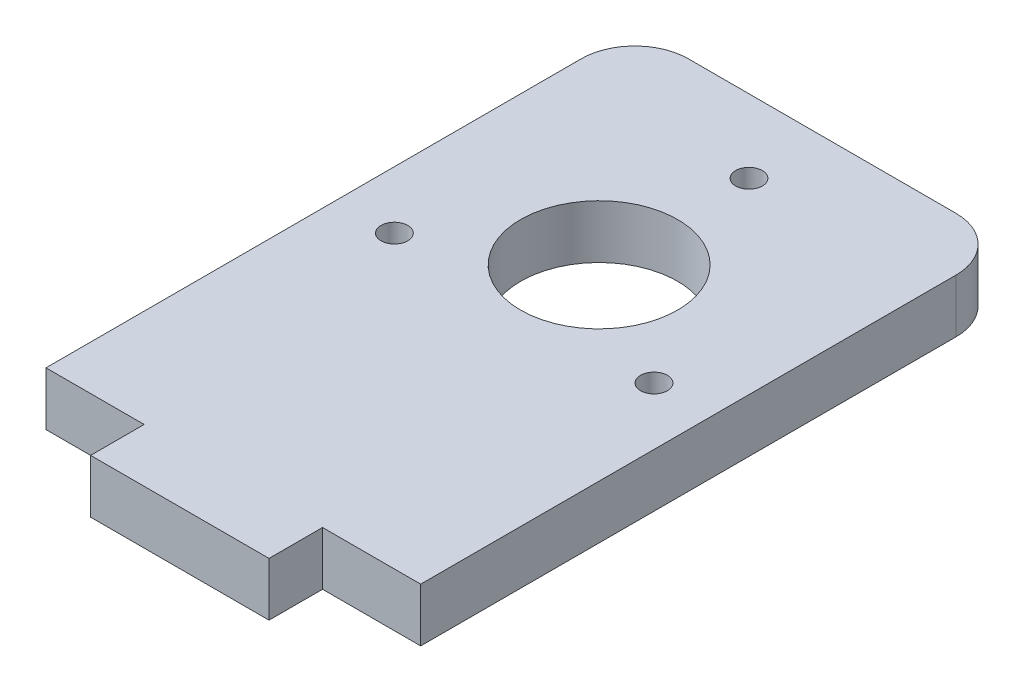
ISO-10303-21;
HEADER;
FILE_DESCRIPTION(('STEP AP214'),'2;1');
FILE_NAME('part.step','',(''),(''),'','','');
FILE_SCHEMA(('AUTOMOTIVE_DESIGN { 1 0 10303 214 1 1 1 1 }'));
ENDSEC;
DATA;
#1=APPLICATION_CONTEXT('core data for automotive mechanical design processes');
#2=APPLICATION_PROTOCOL_DEFINITION('international standard','automotive_design',2000,#1);
#3=PRODUCT_CONTEXT('',#1,'mechanical');
#4=PRODUCT('Part','Part','',(#3));
#5=PRODUCT_RELATED_PRODUCT_CATEGORY('part','',(#4));
#6=PRODUCT_DEFINITION_FORMATION('','',#4);
#7=PRODUCT_DEFINITION_CONTEXT('part definition',#1,'design');
#8=PRODUCT_DEFINITION('design','',#6,#7);
#9=PRODUCT_DEFINITION_SHAPE('','',#8);
#10=(LENGTH_UNIT() NAMED_UNIT(*) SI_UNIT(.MILLI.,.METRE.));
#11=(NAMED_UNIT(*) PLANE_ANGLE_UNIT() SI_UNIT($,.RADIAN.));
#12=(NAMED_UNIT(*) SI_UNIT($,.STERADIAN.) SOLID_ANGLE_UNIT());
#13=UNCERTAINTY_MEASURE_WITH_UNIT(LENGTH_MEASURE(1.E-05),#10,'distance_accuracy_value','');
#14=(GEOMETRIC_REPRESENTATION_CONTEXT(3) GLOBAL_UNCERTAINTY_ASSIGNED_CONTEXT((#13)) GLOBAL_UNIT_ASSIGNED_CONTEXT((#10,
#11,#12)) REPRESENTATION_CONTEXT('',''));
#15=CARTESIAN_POINT('',(0.,0.,0.));
#16=DIRECTION('',(0.,0.,1.));
#17=DIRECTION('',(1.,0.,0.));
#18=AXIS2_PLACEMENT_3D('',#15,#16,#17);
#19=CARTESIAN_POINT('',(7.5,3.,-33.));
#20=DIRECTION('',(0.,-1.,0.));
#21=DIRECTION('',(0.,0.,-1.));
#22=AXIS2_PLACEMENT_3D('',#19,#20,#21);
#23=PLANE('',#22);
#24=DIRECTION('',(0.,0.,1.));
#25=VECTOR('',#24,1.);
#26=CARTESIAN_POINT('',(-10.5,3.,-33.));
#27=LINE('',#26,#25);
#28=CARTESIAN_POINT('',(-10.5,3.,-33.));
#29=VERTEX_POINT('',#28);
#30=CARTESIAN_POINT('',(-10.5,3.,-3.));
#31=VERTEX_POINT('',#30);
#32=EDGE_CURVE('E161',#29,#31,#27,.T.);
#33=ORIENTED_EDGE('',*,*,#32,.T.);
#34=DIRECTION('',(1.,0.,0.));
#35=VECTOR('',#34,1.);
#36=CARTESIAN_POINT('',(-10.5,3.,-3.));
#37=LINE('',#36,#35);
#38=CARTESIAN_POINT('',(-5.,3.,-3.));
#39=VERTEX_POINT('',#38);
#40=EDGE_CURVE('E99',#31,#39,#37,.T.);
#41=ORIENTED_EDGE('',*,*,#40,.T.);
#42=DIRECTION('',(0.,0.,1.));
#43=VECTOR('',#42,1.);
#44=CARTESIAN_POINT('',(-5.,3.,-3.));
#45=LINE('',#44,#43);
#46=CARTESIAN_POINT('',(-5.,3.,0.));
#47=VERTEX_POINT('',#46);
#48=EDGE_CURVE('E182',#39,#47,#45,.T.);
#49=ORIENTED_EDGE('',*,*,#48,.T.);
#50=DIRECTION('',(1.,0.,0.));
#51=VECTOR('',#50,1.);
#52=CARTESIAN_POINT('',(-5.,3.,0.));
#53=LINE('',#52,#51);
#54=CARTESIAN_POINT('',(5.,3.,0.));
#55=VERTEX_POINT('',#54);
#56=EDGE_CURVE('E201',#47,#55,#53,.T.);
#57=ORIENTED_EDGE('',*,*,#56,.T.);
#58=DIRECTION('',(0.,0.,-1.));
#59=VECTOR('',#58,1.);
#60=CARTESIAN_POINT('',(5.,3.,0.));
#61=LINE('',#60,#59);
#62=CARTESIAN_POINT('',(5.,3.,-3.));
#63=VERTEX_POINT('',#62);
#64=EDGE_CURVE('E198',#55,#63,#61,.T.);
#65=ORIENTED_EDGE('',*,*,#64,.T.);
#66=DIRECTION('',(1.,0.,0.));
#67=VECTOR('',#66,1.);
#68=CARTESIAN_POINT('',(5.,3.,-3.));
#69=LINE('',#68,#67);
#70=CARTESIAN_POINT('',(10.5,3.,-3.));
#71=VERTEX_POINT('',#70);
#72=EDGE_CURVE('E200',#63,#71,#69,.T.);
#73=ORIENTED_EDGE('',*,*,#72,.T.);
#74=DIRECTION('',(0.,0.,-1.));
#75=VECTOR('',#74,1.);
#76=CARTESIAN_POINT('',(10.5,3.,-33.));
#77=LINE('',#76,#75);
#78=CARTESIAN_POINT('',(10.5,3.,-33.));
#79=VERTEX_POINT('',#78);
#80=EDGE_CURVE('E124',#71,#79,#77,.T.);
#81=ORIENTED_EDGE('',*,*,#80,.T.);
#82=CARTESIAN_POINT('',(7.5,3.,-33.));
#83=DIRECTION('',(0.,1.,0.));
#84=DIRECTION('',(0.,0.,-1.));
#85=AXIS2_PLACEMENT_3D('',#82,#83,#84);
#86=CIRCLE('',#85,3.);
#87=CARTESIAN_POINT('',(7.5,3.,-36.));
#88=VERTEX_POINT('',#87);
#89=EDGE_CURVE('E118',#79,#88,#86,.T.);
#90=ORIENTED_EDGE('',*,*,#89,.T.);
#91=DIRECTION('',(-1.,0.,0.));
#92=VECTOR('',#91,1.);
#93=CARTESIAN_POINT('',(-7.5,3.,-36.));
#94=LINE('',#93,#92);
#95=CARTESIAN_POINT('',(-7.5,3.,-36.));
#96=VERTEX_POINT('',#95);
#97=EDGE_CURVE('E122',#88,#96,#94,.T.);
#98=ORIENTED_EDGE('',*,*,#97,.T.);
#99=CARTESIAN_POINT('',(-7.5,3.,-33.));
#100=DIRECTION('',(0.,1.,0.));
#101=DIRECTION('',(0.,0.,1.));
#102=AXIS2_PLACEMENT_3D('',#99,#100,#101);
#103=CIRCLE('',#102,3.);
#104=EDGE_CURVE('E50',#96,#29,#103,.T.);
#105=ORIENTED_EDGE('',*,*,#104,.T.);
#106=EDGE_LOOP('',(#33,#41,#49,#57,#65,#73,#81,#90,#98,#105));
#107=FACE_BOUND('',#106,.T.);
#108=CARTESIAN_POINT('',(0.,3.,-23.5));
#109=DIRECTION('',(0.,1.,0.));
#110=DIRECTION('',(0.,0.,1.));
#111=AXIS2_PLACEMENT_3D('',#108,#109,#110);
#112=CIRCLE('',#111,4.4);
#113=CARTESIAN_POINT('',(0.,3.,-19.1));
#114=VERTEX_POINT('',#113);
#115=EDGE_CURVE('E146',#114,#114,#112,.T.);
#116=ORIENTED_EDGE('',*,*,#115,.F.);
#117=EDGE_LOOP('',(#116));
#118=FACE_BOUND('',#117,.T.);
#119=CARTESIAN_POINT('',(0.,3.,-31.9));
#120=DIRECTION('',(0.,1.,0.));
#121=DIRECTION('',(0.,0.,1.));
#122=AXIS2_PLACEMENT_3D('',#119,#120,#121);
#123=CIRCLE('',#122,0.75);
#124=CARTESIAN_POINT('',(0.,3.,-31.15));
#125=VERTEX_POINT('',#124);
#126=EDGE_CURVE('E212',#125,#125,#123,.T.);
#127=ORIENTED_EDGE('',*,*,#126,.F.);
#128=EDGE_LOOP('',(#127));
#129=FACE_BOUND('',#128,.T.);
#130=CARTESIAN_POINT('',(7.27461339178929,3.,-19.3));
#131=DIRECTION('',(0.,1.,0.));
#132=DIRECTION('',(0.,0.,1.));
#133=AXIS2_PLACEMENT_3D('',#130,#131,#132);
#134=CIRCLE('',#133,0.75);
#135=CARTESIAN_POINT('',(7.27461339178929,3.,-18.55));
#136=VERTEX_POINT('',#135);
#137=EDGE_CURVE('E218',#136,#136,#134,.T.);
#138=ORIENTED_EDGE('',*,*,#137,.F.);
#139=EDGE_LOOP('',(#138));
#140=FACE_BOUND('',#139,.T.);
#141=CARTESIAN_POINT('',(-7.27461339178928,3.,-19.3));
#142=DIRECTION('',(0.,1.,0.));
#143=DIRECTION('',(0.,0.,1.));
#144=AXIS2_PLACEMENT_3D('',#141,#142,#143);
#145=CIRCLE('',#144,0.75);
#146=CARTESIAN_POINT('',(-7.27461339178928,3.,-18.55));
#147=VERTEX_POINT('',#146);
#148=EDGE_CURVE('E224',#147,#147,#145,.T.);
#149=ORIENTED_EDGE('',*,*,#148,.F.);
#150=EDGE_LOOP('',(#149));
#151=FACE_BOUND('',#150,.T.);
#152=ADVANCED_FACE('F33',(#107,#118,#129,#140,#151),#23,.F.);
#153=CARTESIAN_POINT('',(7.5,0.,-33.));
#154=DIRECTION('',(0.,-1.,0.));
#155=DIRECTION('',(0.,0.,-1.));
#156=AXIS2_PLACEMENT_3D('',#153,#154,#155);
#157=PLANE('',#156);
#158=CARTESIAN_POINT('',(7.27461339178929,0.,-19.3));
#159=DIRECTION('',(0.,1.,0.));
#160=DIRECTION('',(0.,0.,1.));
#161=AXIS2_PLACEMENT_3D('',#158,#159,#160);
#162=CIRCLE('',#161,0.75);
#163=CARTESIAN_POINT('',(7.27461339178929,0.,-18.55));
#164=VERTEX_POINT('',#163);
#165=EDGE_CURVE('E221',#164,#164,#162,.T.);
#166=ORIENTED_EDGE('',*,*,#165,.T.);
#167=EDGE_LOOP('',(#166));
#168=FACE_BOUND('',#167,.T.);
#169=CARTESIAN_POINT('',(0.,0.,-23.5));
#170=DIRECTION('',(0.,1.,0.));
#171=DIRECTION('',(0.,0.,1.));
#172=AXIS2_PLACEMENT_3D('',#169,#170,#171);
#173=CIRCLE('',#172,4.4);
#174=CARTESIAN_POINT('',(0.,0.,-19.1));
#175=VERTEX_POINT('',#174);
#176=EDGE_CURVE('E209',#175,#175,#173,.T.);
#177=ORIENTED_EDGE('',*,*,#176,.T.);
#178=EDGE_LOOP('',(#177));
#179=FACE_BOUND('',#178,.T.);
#180=DIRECTION('',(0.,0.,1.));
#181=VECTOR('',#180,1.);
#182=CARTESIAN_POINT('',(-10.5,0.,-33.));
#183=LINE('',#182,#181);
#184=CARTESIAN_POINT('',(-10.5,0.,-33.));
#185=VERTEX_POINT('',#184);
#186=CARTESIAN_POINT('',(-10.5,0.,-3.));
#187=VERTEX_POINT('',#186);
#188=EDGE_CURVE('E142',#185,#187,#183,.T.);
#189=ORIENTED_EDGE('',*,*,#188,.F.);
#190=CARTESIAN_POINT('',(-7.5,0.,-33.));
#191=DIRECTION('',(0.,1.,0.));
#192=DIRECTION('',(0.,0.,1.));
#193=AXIS2_PLACEMENT_3D('',#190,#191,#192);
#194=CIRCLE('',#193,3.);
#195=CARTESIAN_POINT('',(-7.5,0.,-36.));
#196=VERTEX_POINT('',#195);
#197=EDGE_CURVE('E91',#196,#185,#194,.T.);
#198=ORIENTED_EDGE('',*,*,#197,.F.);
#199=DIRECTION('',(-1.,0.,0.));
#200=VECTOR('',#199,1.);
#201=CARTESIAN_POINT('',(-7.5,0.,-36.));
#202=LINE('',#201,#200);
#203=CARTESIAN_POINT('',(7.5,0.,-36.));
#204=VERTEX_POINT('',#203);
#205=EDGE_CURVE('E85',#204,#196,#202,.T.);
#206=ORIENTED_EDGE('',*,*,#205,.F.);
#207=CARTESIAN_POINT('',(7.5,0.,-33.));
#208=DIRECTION('',(0.,1.,0.));
#209=DIRECTION('',(0.,0.,-1.));
#210=AXIS2_PLACEMENT_3D('',#207,#208,#209);
#211=CIRCLE('',#210,3.);
#212=CARTESIAN_POINT('',(10.5,0.,-33.));
#213=VERTEX_POINT('',#212);
#214=EDGE_CURVE('E132',#213,#204,#211,.T.);
#215=ORIENTED_EDGE('',*,*,#214,.F.);
#216=DIRECTION('',(0.,0.,-1.));
#217=VECTOR('',#216,1.);
#218=CARTESIAN_POINT('',(10.5,0.,-33.));
#219=LINE('',#218,#217);
#220=CARTESIAN_POINT('',(10.5,0.,-3.));
#221=VERTEX_POINT('',#220);
#222=EDGE_CURVE('E156',#221,#213,#219,.T.);
#223=ORIENTED_EDGE('',*,*,#222,.F.);
#224=DIRECTION('',(1.,0.,0.));
#225=VECTOR('',#224,1.);
#226=CARTESIAN_POINT('',(5.,0.,-3.));
#227=LINE('',#226,#225);
#228=CARTESIAN_POINT('',(5.,0.,-3.));
#229=VERTEX_POINT('',#228);
#230=EDGE_CURVE('E154',#229,#221,#227,.T.);
#231=ORIENTED_EDGE('',*,*,#230,.F.);
#232=DIRECTION('',(0.,0.,-1.));
#233=VECTOR('',#232,1.);
#234=CARTESIAN_POINT('',(5.,0.,0.));
#235=LINE('',#234,#233);
#236=CARTESIAN_POINT('',(5.,0.,0.));
#237=VERTEX_POINT('',#236);
#238=EDGE_CURVE('E152',#237,#229,#235,.T.);
#239=ORIENTED_EDGE('',*,*,#238,.F.);
#240=DIRECTION('',(1.,0.,0.));
#241=VECTOR('',#240,1.);
#242=CARTESIAN_POINT('',(-5.,0.,0.));
#243=LINE('',#242,#241);
#244=CARTESIAN_POINT('',(-5.,0.,0.));
#245=VERTEX_POINT('',#244);
#246=EDGE_CURVE('E150',#245,#237,#243,.T.);
#247=ORIENTED_EDGE('',*,*,#246,.F.);
#248=DIRECTION('',(0.,0.,1.));
#249=VECTOR('',#248,1.);
#250=CARTESIAN_POINT('',(-5.,0.,-3.));
#251=LINE('',#250,#249);
#252=CARTESIAN_POINT('',(-5.,0.,-3.));
#253=VERTEX_POINT('',#252);
#254=EDGE_CURVE('E148',#253,#245,#251,.T.);
#255=ORIENTED_EDGE('',*,*,#254,.F.);
#256=DIRECTION('',(1.,0.,0.));
#257=VECTOR('',#256,1.);
#258=CARTESIAN_POINT('',(-10.5,0.,-3.));
#259=LINE('',#258,#257);
#260=EDGE_CURVE('E145',#187,#253,#259,.T.);
#261=ORIENTED_EDGE('',*,*,#260,.F.);
#262=EDGE_LOOP('',(#189,#198,#206,#215,#223,#231,#239,#247,#255,#261));
#263=FACE_BOUND('',#262,.T.);
#264=CARTESIAN_POINT('',(0.,0.,-31.9));
#265=DIRECTION('',(0.,1.,0.));
#266=DIRECTION('',(0.,0.,1.));
#267=AXIS2_PLACEMENT_3D('',#264,#265,#266);
#268=CIRCLE('',#267,0.75);
#269=CARTESIAN_POINT('',(0.,0.,-31.15));
#270=VERTEX_POINT('',#269);
#271=EDGE_CURVE('E215',#270,#270,#268,.T.);
#272=ORIENTED_EDGE('',*,*,#271,.T.);
#273=EDGE_LOOP('',(#272));
#274=FACE_BOUND('',#273,.T.);
#275=CARTESIAN_POINT('',(-7.27461339178928,0.,-19.3));
#276=DIRECTION('',(0.,1.,0.));
#277=DIRECTION('',(0.,0.,1.));
#278=AXIS2_PLACEMENT_3D('',#275,#276,#277);
#279=CIRCLE('',#278,0.75);
#280=CARTESIAN_POINT('',(-7.27461339178928,0.,-18.55));
#281=VERTEX_POINT('',#280);
#282=EDGE_CURVE('E227',#281,#281,#279,.T.);
#283=ORIENTED_EDGE('',*,*,#282,.T.);
#284=EDGE_LOOP('',(#283));
#285=FACE_BOUND('',#284,.T.);
#286=ADVANCED_FACE('F186',(#168,#179,#263,#274,#285),#157,.T.);
#287=CARTESIAN_POINT('',(-10.5,3.,-33.));
#288=DIRECTION('',(1.,0.,0.));
#289=DIRECTION('',(0.,0.,-1.));
#290=AXIS2_PLACEMENT_3D('',#287,#288,#289);
#291=PLANE('',#290);
#292=ORIENTED_EDGE('',*,*,#188,.T.);
#293=DIRECTION('',(0.,-1.,0.));
#294=VECTOR('',#293,1.);
#295=CARTESIAN_POINT('',(-10.5,3.,-3.));
#296=LINE('',#295,#294);
#297=EDGE_CURVE('E11',#31,#187,#296,.T.);
#298=ORIENTED_EDGE('',*,*,#297,.F.);
#299=ORIENTED_EDGE('',*,*,#32,.F.);
#300=DIRECTION('',(0.,-1.,0.));
#301=VECTOR('',#300,1.);
#302=CARTESIAN_POINT('',(-10.5,3.,-33.));
#303=LINE('',#302,#301);
#304=EDGE_CURVE('E138',#29,#185,#303,.T.);
#305=ORIENTED_EDGE('',*,*,#304,.T.);
#306=EDGE_LOOP('',(#292,#298,#299,#305));
#307=FACE_BOUND('',#306,.T.);
#308=ADVANCED_FACE('F35',(#307),#291,.F.);
#309=CARTESIAN_POINT('',(-10.5,3.,-3.));
#310=DIRECTION('',(0.,0.,-1.));
#311=DIRECTION('',(-1.,0.,0.));
#312=AXIS2_PLACEMENT_3D('',#309,#310,#311);
#313=PLANE('',#312);
#314=ORIENTED_EDGE('',*,*,#260,.T.);
#315=DIRECTION('',(0.,-1.,0.));
#316=VECTOR('',#315,1.);
#317=CARTESIAN_POINT('',(-5.,3.,-3.));
#318=LINE('',#317,#316);
#319=EDGE_CURVE('E42',#39,#253,#318,.T.);
#320=ORIENTED_EDGE('',*,*,#319,.F.);
#321=ORIENTED_EDGE('',*,*,#40,.F.);
#322=ORIENTED_EDGE('',*,*,#297,.T.);
#323=EDGE_LOOP('',(#314,#320,#321,#322));
#324=FACE_BOUND('',#323,.T.);
#325=ADVANCED_FACE('F267',(#324),#313,.F.);
#326=CARTESIAN_POINT('',(-5.,3.,-3.));
#327=DIRECTION('',(1.,0.,0.));
#328=DIRECTION('',(0.,0.,-1.));
#329=AXIS2_PLACEMENT_3D('',#326,#327,#328);
#330=PLANE('',#329);
#331=ORIENTED_EDGE('',*,*,#254,.T.);
#332=DIRECTION('',(0.,-1.,0.));
#333=VECTOR('',#332,1.);
#334=CARTESIAN_POINT('',(-5.,3.,0.));
#335=LINE('',#334,#333);
#336=EDGE_CURVE('E174',#47,#245,#335,.T.);
#337=ORIENTED_EDGE('',*,*,#336,.F.);
#338=ORIENTED_EDGE('',*,*,#48,.F.);
#339=ORIENTED_EDGE('',*,*,#319,.T.);
#340=EDGE_LOOP('',(#331,#337,#338,#339));
#341=FACE_BOUND('',#340,.T.);
#342=ADVANCED_FACE('F180',(#341),#330,.F.);
#343=CARTESIAN_POINT('',(-5.,3.,0.));
#344=DIRECTION('',(0.,0.,-1.));
#345=DIRECTION('',(-1.,0.,0.));
#346=AXIS2_PLACEMENT_3D('',#343,#344,#345);
#347=PLANE('',#346);
#348=ORIENTED_EDGE('',*,*,#246,.T.);
#349=DIRECTION('',(0.,-1.,0.));
#350=VECTOR('',#349,1.);
#351=CARTESIAN_POINT('',(5.,3.,0.));
#352=LINE('',#351,#350);
#353=EDGE_CURVE('E171',#55,#237,#352,.T.);
#354=ORIENTED_EDGE('',*,*,#353,.F.);
#355=ORIENTED_EDGE('',*,*,#56,.F.);
#356=ORIENTED_EDGE('',*,*,#336,.T.);
#357=EDGE_LOOP('',(#348,#354,#355,#356));
#358=FACE_BOUND('',#357,.T.);
#359=ADVANCED_FACE('F192',(#358),#347,.F.);
#360=CARTESIAN_POINT('',(5.,3.,0.));
#361=DIRECTION('',(-1.,0.,0.));
#362=DIRECTION('',(0.,0.,1.));
#363=AXIS2_PLACEMENT_3D('',#360,#361,#362);
#364=PLANE('',#363);
#365=ORIENTED_EDGE('',*,*,#238,.T.);
#366=DIRECTION('',(0.,-1.,0.));
#367=VECTOR('',#366,1.);
#368=CARTESIAN_POINT('',(5.,3.,-3.));
#369=LINE('',#368,#367);
#370=EDGE_CURVE('E168',#63,#229,#369,.T.);
#371=ORIENTED_EDGE('',*,*,#370,.F.);
#372=ORIENTED_EDGE('',*,*,#64,.F.);
#373=ORIENTED_EDGE('',*,*,#353,.T.);
#374=EDGE_LOOP('',(#365,#371,#372,#373));
#375=FACE_BOUND('',#374,.T.);
#376=ADVANCED_FACE('F196',(#375),#364,.F.);
#377=CARTESIAN_POINT('',(5.,3.,-3.));
#378=DIRECTION('',(0.,0.,-1.));
#379=DIRECTION('',(-1.,0.,0.));
#380=AXIS2_PLACEMENT_3D('',#377,#378,#379);
#381=PLANE('',#380);
#382=ORIENTED_EDGE('',*,*,#230,.T.);
#383=DIRECTION('',(0.,-1.,0.));
#384=VECTOR('',#383,1.);
#385=CARTESIAN_POINT('',(10.5,3.,-3.));
#386=LINE('',#385,#384);
#387=EDGE_CURVE('E165',#71,#221,#386,.T.);
#388=ORIENTED_EDGE('',*,*,#387,.F.);
#389=ORIENTED_EDGE('',*,*,#72,.F.);
#390=ORIENTED_EDGE('',*,*,#370,.T.);
#391=EDGE_LOOP('',(#382,#388,#389,#390));
#392=FACE_BOUND('',#391,.T.);
#393=ADVANCED_FACE('F257',(#392),#381,.F.);
#394=CARTESIAN_POINT('',(10.5,3.,-33.));
#395=DIRECTION('',(-1.,0.,0.));
#396=DIRECTION('',(0.,0.,1.));
#397=AXIS2_PLACEMENT_3D('',#394,#395,#396);
#398=PLANE('',#397);
#399=ORIENTED_EDGE('',*,*,#222,.T.);
#400=DIRECTION('',(0.,-1.,0.));
#401=VECTOR('',#400,1.);
#402=CARTESIAN_POINT('',(10.5,3.,-33.));
#403=LINE('',#402,#401);
#404=EDGE_CURVE('E133',#79,#213,#403,.T.);
#405=ORIENTED_EDGE('',*,*,#404,.F.);
#406=ORIENTED_EDGE('',*,*,#80,.F.);
#407=ORIENTED_EDGE('',*,*,#387,.T.);
#408=EDGE_LOOP('',(#399,#405,#406,#407));
#409=FACE_BOUND('',#408,.T.);
#410=ADVANCED_FACE('F254',(#409),#398,.F.);
#411=CARTESIAN_POINT('',(7.5,3.,-33.));
#412=DIRECTION('',(0.,-1.,0.));
#413=DIRECTION('',(0.,0.,-1.));
#414=AXIS2_PLACEMENT_3D('',#411,#412,#413);
#415=CYLINDRICAL_SURFACE('',#414,3.);
#416=ORIENTED_EDGE('',*,*,#214,.T.);
#417=DIRECTION('',(0.,-1.,0.));
#418=VECTOR('',#417,1.);
#419=CARTESIAN_POINT('',(7.5,3.,-36.));
#420=LINE('',#419,#418);
#421=EDGE_CURVE('E129',#88,#204,#420,.T.);
#422=ORIENTED_EDGE('',*,*,#421,.F.);
#423=ORIENTED_EDGE('',*,*,#89,.F.);
#424=ORIENTED_EDGE('',*,*,#404,.T.);
#425=EDGE_LOOP('',(#416,#422,#423,#424));
#426=FACE_BOUND('',#425,.T.);
#427=ADVANCED_FACE('F130',(#426),#415,.T.);
#428=CARTESIAN_POINT('',(-7.5,3.,-36.));
#429=DIRECTION('',(0.,0.,1.));
#430=DIRECTION('',(1.,0.,0.));
#431=AXIS2_PLACEMENT_3D('',#428,#429,#430);
#432=PLANE('',#431);
#433=ORIENTED_EDGE('',*,*,#205,.T.);
#434=DIRECTION('',(0.,-1.,0.));
#435=VECTOR('',#434,1.);
#436=CARTESIAN_POINT('',(-7.5,3.,-36.));
#437=LINE('',#436,#435);
#438=EDGE_CURVE('E134',#96,#196,#437,.T.);
#439=ORIENTED_EDGE('',*,*,#438,.F.);
#440=ORIENTED_EDGE('',*,*,#97,.F.);
#441=ORIENTED_EDGE('',*,*,#421,.T.);
#442=EDGE_LOOP('',(#433,#439,#440,#441));
#443=FACE_BOUND('',#442,.T.);
#444=ADVANCED_FACE('F136',(#443),#432,.F.);
#445=CARTESIAN_POINT('',(-7.5,3.,-33.));
#446=DIRECTION('',(0.,-1.,0.));
#447=DIRECTION('',(0.,0.,-1.));
#448=AXIS2_PLACEMENT_3D('',#445,#446,#447);
#449=CYLINDRICAL_SURFACE('',#448,3.);
#450=ORIENTED_EDGE('',*,*,#197,.T.);
#451=ORIENTED_EDGE('',*,*,#304,.F.);
#452=ORIENTED_EDGE('',*,*,#104,.F.);
#453=ORIENTED_EDGE('',*,*,#438,.T.);
#454=EDGE_LOOP('',(#450,#451,#452,#453));
#455=FACE_BOUND('',#454,.T.);
#456=ADVANCED_FACE('F247',(#455),#449,.T.);
#457=CARTESIAN_POINT('',(0.,3.,-23.5));
#458=DIRECTION('',(0.,-1.,0.));
#459=DIRECTION('',(0.,0.,-1.));
#460=AXIS2_PLACEMENT_3D('',#457,#458,#459);
#461=CYLINDRICAL_SURFACE('',#460,4.4);
#462=ORIENTED_EDGE('',*,*,#115,.T.);
#463=EDGE_LOOP('',(#462));
#464=FACE_BOUND('',#463,.T.);
#465=ORIENTED_EDGE('',*,*,#176,.F.);
#466=EDGE_LOOP('',(#465));
#467=FACE_BOUND('',#466,.T.);
#468=ADVANCED_FACE('F244',(#464,#467),#461,.F.);
#469=CARTESIAN_POINT('',(0.,3.,-31.9));
#470=DIRECTION('',(0.,-1.,0.));
#471=DIRECTION('',(0.,0.,-1.));
#472=AXIS2_PLACEMENT_3D('',#469,#470,#471);
#473=CYLINDRICAL_SURFACE('',#472,0.75);
#474=ORIENTED_EDGE('',*,*,#126,.T.);
#475=EDGE_LOOP('',(#474));
#476=FACE_BOUND('',#475,.T.);
#477=ORIENTED_EDGE('',*,*,#271,.F.);
#478=EDGE_LOOP('',(#477));
#479=FACE_BOUND('',#478,.T.);
#480=ADVANCED_FACE('F343',(#476,#479),#473,.F.);
#481=CARTESIAN_POINT('',(7.27461339178929,3.,-19.3));
#482=DIRECTION('',(0.,-1.,0.));
#483=DIRECTION('',(0.,0.,-1.));
#484=AXIS2_PLACEMENT_3D('',#481,#482,#483);
#485=CYLINDRICAL_SURFACE('',#484,0.75);
#486=ORIENTED_EDGE('',*,*,#137,.T.);
#487=EDGE_LOOP('',(#486));
#488=FACE_BOUND('',#487,.T.);
#489=ORIENTED_EDGE('',*,*,#165,.F.);
#490=EDGE_LOOP('',(#489));
#491=FACE_BOUND('',#490,.T.);
#492=ADVANCED_FACE('F351',(#488,#491),#485,.F.);
#493=CARTESIAN_POINT('',(-7.27461339178928,3.,-19.3));
#494=DIRECTION('',(0.,-1.,0.));
#495=DIRECTION('',(0.,0.,-1.));
#496=AXIS2_PLACEMENT_3D('',#493,#494,#495);
#497=CYLINDRICAL_SURFACE('',#496,0.75);
#498=ORIENTED_EDGE('',*,*,#148,.T.);
#499=EDGE_LOOP('',(#498));
#500=FACE_BOUND('',#499,.T.);
#501=ORIENTED_EDGE('',*,*,#282,.F.);
#502=EDGE_LOOP('',(#501));
#503=FACE_BOUND('',#502,.T.);
#504=ADVANCED_FACE('F233',(#500,#503),#497,.F.);
#505=CLOSED_SHELL('',(#152,#286,#308,#325,#342,#359,#376,#393,#410,#427,#444,#456,#468,#480,
#492,#504));
#506=MANIFOLD_SOLID_BREP('B2',#505);
#507=ADVANCED_BREP_SHAPE_REPRESENTATION('',(#18,#506),#14);
#508=SHAPE_DEFINITION_REPRESENTATION(#9,#507);
ENDSEC;
END-ISO-10303-21;
